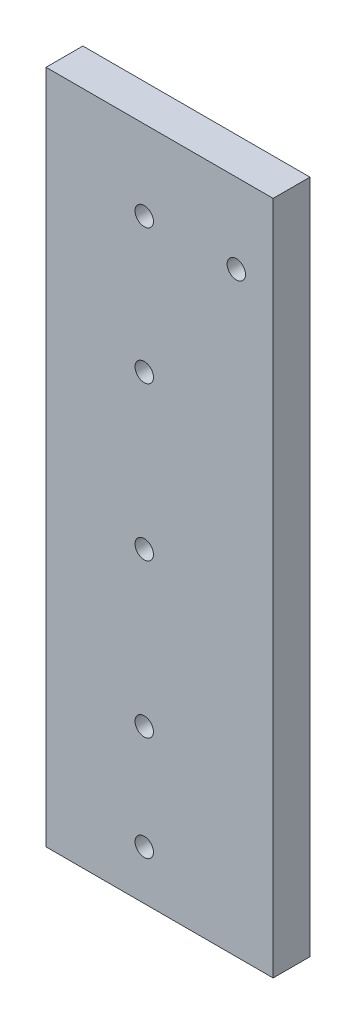
ISO-10303-21;
HEADER;
FILE_DESCRIPTION(('STEP AP214'),'2;1');
FILE_NAME('part.step','',(''),(''),'','','');
FILE_SCHEMA(('AUTOMOTIVE_DESIGN { 1 0 10303 214 1 1 1 1 }'));
ENDSEC;
DATA;
#1=APPLICATION_CONTEXT('core data for automotive mechanical design processes');
#2=APPLICATION_PROTOCOL_DEFINITION('international standard','automotive_design',2000,#1);
#3=PRODUCT_CONTEXT('',#1,'mechanical');
#4=PRODUCT('Part','Part','',(#3));
#5=PRODUCT_RELATED_PRODUCT_CATEGORY('part','',(#4));
#6=PRODUCT_DEFINITION_FORMATION('','',#4);
#7=PRODUCT_DEFINITION_CONTEXT('part definition',#1,'design');
#8=PRODUCT_DEFINITION('design','',#6,#7);
#9=PRODUCT_DEFINITION_SHAPE('','',#8);
#10=(LENGTH_UNIT() NAMED_UNIT(*) SI_UNIT(.MILLI.,.METRE.));
#11=(NAMED_UNIT(*) PLANE_ANGLE_UNIT() SI_UNIT($,.RADIAN.));
#12=(NAMED_UNIT(*) SI_UNIT($,.STERADIAN.) SOLID_ANGLE_UNIT());
#13=UNCERTAINTY_MEASURE_WITH_UNIT(LENGTH_MEASURE(1.E-05),#10,'distance_accuracy_value','');
#14=(GEOMETRIC_REPRESENTATION_CONTEXT(3) GLOBAL_UNCERTAINTY_ASSIGNED_CONTEXT((#13)) GLOBAL_UNIT_ASSIGNED_CONTEXT((#10,
#11,#12)) REPRESENTATION_CONTEXT('',''));
#15=CARTESIAN_POINT('',(0.,0.,0.));
#16=DIRECTION('',(0.,0.,1.));
#17=DIRECTION('',(1.,0.,0.));
#18=AXIS2_PLACEMENT_3D('',#15,#16,#17);
#19=CARTESIAN_POINT('',(0.,0.,30.));
#20=DIRECTION('',(0.,0.,-1.));
#21=DIRECTION('',(-1.,0.,0.));
#22=AXIS2_PLACEMENT_3D('',#19,#20,#21);
#23=PLANE('',#22);
#24=DIRECTION('',(0.,1.,0.));
#25=VECTOR('',#24,1.);
#26=CARTESIAN_POINT('',(92.5,-275.,30.));
#27=LINE('',#26,#25);
#28=CARTESIAN_POINT('',(92.5,-275.,30.));
#29=VERTEX_POINT('',#28);
#30=CARTESIAN_POINT('',(92.5,275.,30.));
#31=VERTEX_POINT('',#30);
#32=EDGE_CURVE('E96',#29,#31,#27,.T.);
#33=ORIENTED_EDGE('',*,*,#32,.T.);
#34=DIRECTION('',(-1.,0.,0.));
#35=VECTOR('',#34,1.);
#36=CARTESIAN_POINT('',(-92.5,275.,30.));
#37=LINE('',#36,#35);
#38=CARTESIAN_POINT('',(-92.5,275.,30.));
#39=VERTEX_POINT('',#38);
#40=EDGE_CURVE('E91',#31,#39,#37,.T.);
#41=ORIENTED_EDGE('',*,*,#40,.T.);
#42=DIRECTION('',(0.,-1.,0.));
#43=VECTOR('',#42,1.);
#44=CARTESIAN_POINT('',(-92.5,-275.,30.));
#45=LINE('',#44,#43);
#46=CARTESIAN_POINT('',(-92.5,-275.,30.));
#47=VERTEX_POINT('',#46);
#48=EDGE_CURVE('E94',#39,#47,#45,.T.);
#49=ORIENTED_EDGE('',*,*,#48,.T.);
#50=DIRECTION('',(1.,0.,0.));
#51=VECTOR('',#50,1.);
#52=CARTESIAN_POINT('',(-92.5,-275.,30.));
#53=LINE('',#52,#51);
#54=EDGE_CURVE('E61',#47,#29,#53,.T.);
#55=ORIENTED_EDGE('',*,*,#54,.T.);
#56=EDGE_LOOP('',(#33,#41,#49,#55));
#57=FACE_BOUND('',#56,.T.);
#58=CARTESIAN_POINT('',(62.5,210.,30.));
#59=DIRECTION('',(0.,0.,1.));
#60=DIRECTION('',(1.,0.,0.));
#61=AXIS2_PLACEMENT_3D('',#58,#59,#60);
#62=CIRCLE('',#61,7.50000000000001);
#63=CARTESIAN_POINT('',(70.,210.,30.));
#64=VERTEX_POINT('',#63);
#65=EDGE_CURVE('E116',#64,#64,#62,.T.);
#66=ORIENTED_EDGE('',*,*,#65,.F.);
#67=EDGE_LOOP('',(#66));
#68=FACE_BOUND('',#67,.T.);
#69=CARTESIAN_POINT('',(-12.5,210.,30.));
#70=DIRECTION('',(0.,0.,1.));
#71=DIRECTION('',(1.,0.,0.));
#72=AXIS2_PLACEMENT_3D('',#69,#70,#71);
#73=CIRCLE('',#72,7.5);
#74=CARTESIAN_POINT('',(-4.99999999999999,210.,30.));
#75=VERTEX_POINT('',#74);
#76=EDGE_CURVE('E138',#75,#75,#73,.T.);
#77=ORIENTED_EDGE('',*,*,#76,.F.);
#78=EDGE_LOOP('',(#77));
#79=FACE_BOUND('',#78,.T.);
#80=CARTESIAN_POINT('',(-12.5,-235.,30.));
#81=DIRECTION('',(0.,0.,1.));
#82=DIRECTION('',(1.,0.,0.));
#83=AXIS2_PLACEMENT_3D('',#80,#81,#82);
#84=CIRCLE('',#83,7.5);
#85=CARTESIAN_POINT('',(-4.99999999999999,-235.,30.));
#86=VERTEX_POINT('',#85);
#87=EDGE_CURVE('E146',#86,#86,#84,.T.);
#88=ORIENTED_EDGE('',*,*,#87,.F.);
#89=EDGE_LOOP('',(#88));
#90=FACE_BOUND('',#89,.T.);
#91=CARTESIAN_POINT('',(-12.5,-150.,30.));
#92=DIRECTION('',(0.,0.,1.));
#93=DIRECTION('',(1.,0.,0.));
#94=AXIS2_PLACEMENT_3D('',#91,#92,#93);
#95=CIRCLE('',#94,7.50000000000001);
#96=CARTESIAN_POINT('',(-4.99999999999999,-150.,30.));
#97=VERTEX_POINT('',#96);
#98=EDGE_CURVE('E154',#97,#97,#95,.T.);
#99=ORIENTED_EDGE('',*,*,#98,.F.);
#100=EDGE_LOOP('',(#99));
#101=FACE_BOUND('',#100,.T.);
#102=CARTESIAN_POINT('',(-12.5,-25.,30.));
#103=DIRECTION('',(0.,0.,1.));
#104=DIRECTION('',(1.,0.,0.));
#105=AXIS2_PLACEMENT_3D('',#102,#103,#104);
#106=CIRCLE('',#105,7.5);
#107=CARTESIAN_POINT('',(-5.,-25.,30.));
#108=VERTEX_POINT('',#107);
#109=EDGE_CURVE('E162',#108,#108,#106,.T.);
#110=ORIENTED_EDGE('',*,*,#109,.F.);
#111=EDGE_LOOP('',(#110));
#112=FACE_BOUND('',#111,.T.);
#113=CARTESIAN_POINT('',(-12.5,100.,30.));
#114=DIRECTION('',(0.,0.,1.));
#115=DIRECTION('',(1.,0.,0.));
#116=AXIS2_PLACEMENT_3D('',#113,#114,#115);
#117=CIRCLE('',#116,7.50000000000001);
#118=CARTESIAN_POINT('',(-4.99999999999999,100.,30.));
#119=VERTEX_POINT('',#118);
#120=EDGE_CURVE('E170',#119,#119,#117,.T.);
#121=ORIENTED_EDGE('',*,*,#120,.F.);
#122=EDGE_LOOP('',(#121));
#123=FACE_BOUND('',#122,.T.);
#124=ADVANCED_FACE('F43',(#57,#68,#79,#90,#101,#112,#123),#23,.F.);
#125=CARTESIAN_POINT('',(0.,0.,0.));
#126=DIRECTION('',(0.,0.,-1.));
#127=DIRECTION('',(-1.,0.,0.));
#128=AXIS2_PLACEMENT_3D('',#125,#126,#127);
#129=PLANE('',#128);
#130=CARTESIAN_POINT('',(-12.5,-25.,0.));
#131=DIRECTION('',(0.,0.,1.));
#132=DIRECTION('',(1.,0.,0.));
#133=AXIS2_PLACEMENT_3D('',#130,#131,#132);
#134=CIRCLE('',#133,7.5);
#135=CARTESIAN_POINT('',(-5.,-25.,0.));
#136=VERTEX_POINT('',#135);
#137=EDGE_CURVE('E166',#136,#136,#134,.T.);
#138=ORIENTED_EDGE('',*,*,#137,.T.);
#139=EDGE_LOOP('',(#138));
#140=FACE_BOUND('',#139,.T.);
#141=CARTESIAN_POINT('',(-12.5,-235.,0.));
#142=DIRECTION('',(0.,0.,1.));
#143=DIRECTION('',(1.,0.,0.));
#144=AXIS2_PLACEMENT_3D('',#141,#142,#143);
#145=CIRCLE('',#144,7.5);
#146=CARTESIAN_POINT('',(-4.99999999999999,-235.,0.));
#147=VERTEX_POINT('',#146);
#148=EDGE_CURVE('E150',#147,#147,#145,.T.);
#149=ORIENTED_EDGE('',*,*,#148,.T.);
#150=EDGE_LOOP('',(#149));
#151=FACE_BOUND('',#150,.T.);
#152=CARTESIAN_POINT('',(62.5,210.,0.));
#153=DIRECTION('',(0.,0.,1.));
#154=DIRECTION('',(1.,0.,0.));
#155=AXIS2_PLACEMENT_3D('',#152,#153,#154);
#156=CIRCLE('',#155,7.50000000000001);
#157=CARTESIAN_POINT('',(70.,210.,0.));
#158=VERTEX_POINT('',#157);
#159=EDGE_CURVE('E134',#158,#158,#156,.T.);
#160=ORIENTED_EDGE('',*,*,#159,.T.);
#161=EDGE_LOOP('',(#160));
#162=FACE_BOUND('',#161,.T.);
#163=DIRECTION('',(0.,1.,0.));
#164=VECTOR('',#163,1.);
#165=CARTESIAN_POINT('',(92.5,-275.,0.));
#166=LINE('',#165,#164);
#167=CARTESIAN_POINT('',(92.5,-275.,0.));
#168=VERTEX_POINT('',#167);
#169=CARTESIAN_POINT('',(92.5,275.,0.));
#170=VERTEX_POINT('',#169);
#171=EDGE_CURVE('E112',#168,#170,#166,.T.);
#172=ORIENTED_EDGE('',*,*,#171,.F.);
#173=DIRECTION('',(1.,0.,0.));
#174=VECTOR('',#173,1.);
#175=CARTESIAN_POINT('',(-92.5,-275.,0.));
#176=LINE('',#175,#174);
#177=CARTESIAN_POINT('',(-92.5,-275.,0.));
#178=VERTEX_POINT('',#177);
#179=EDGE_CURVE('E84',#178,#168,#176,.T.);
#180=ORIENTED_EDGE('',*,*,#179,.F.);
#181=DIRECTION('',(0.,-1.,0.));
#182=VECTOR('',#181,1.);
#183=CARTESIAN_POINT('',(-92.5,-275.,0.));
#184=LINE('',#183,#182);
#185=CARTESIAN_POINT('',(-92.5,275.,0.));
#186=VERTEX_POINT('',#185);
#187=EDGE_CURVE('E78',#186,#178,#184,.T.);
#188=ORIENTED_EDGE('',*,*,#187,.F.);
#189=DIRECTION('',(-1.,0.,0.));
#190=VECTOR('',#189,1.);
#191=CARTESIAN_POINT('',(-92.5,275.,0.));
#192=LINE('',#191,#190);
#193=EDGE_CURVE('E101',#170,#186,#192,.T.);
#194=ORIENTED_EDGE('',*,*,#193,.F.);
#195=EDGE_LOOP('',(#172,#180,#188,#194));
#196=FACE_BOUND('',#195,.T.);
#197=CARTESIAN_POINT('',(-12.5,210.,0.));
#198=DIRECTION('',(0.,0.,1.));
#199=DIRECTION('',(1.,0.,0.));
#200=AXIS2_PLACEMENT_3D('',#197,#198,#199);
#201=CIRCLE('',#200,7.5);
#202=CARTESIAN_POINT('',(-4.99999999999999,210.,0.));
#203=VERTEX_POINT('',#202);
#204=EDGE_CURVE('E142',#203,#203,#201,.T.);
#205=ORIENTED_EDGE('',*,*,#204,.T.);
#206=EDGE_LOOP('',(#205));
#207=FACE_BOUND('',#206,.T.);
#208=CARTESIAN_POINT('',(-12.5,-150.,0.));
#209=DIRECTION('',(0.,0.,1.));
#210=DIRECTION('',(1.,0.,0.));
#211=AXIS2_PLACEMENT_3D('',#208,#209,#210);
#212=CIRCLE('',#211,7.50000000000001);
#213=CARTESIAN_POINT('',(-4.99999999999999,-150.,0.));
#214=VERTEX_POINT('',#213);
#215=EDGE_CURVE('E158',#214,#214,#212,.T.);
#216=ORIENTED_EDGE('',*,*,#215,.T.);
#217=EDGE_LOOP('',(#216));
#218=FACE_BOUND('',#217,.T.);
#219=CARTESIAN_POINT('',(-12.5,100.,0.));
#220=DIRECTION('',(0.,0.,1.));
#221=DIRECTION('',(1.,0.,0.));
#222=AXIS2_PLACEMENT_3D('',#219,#220,#221);
#223=CIRCLE('',#222,7.50000000000001);
#224=CARTESIAN_POINT('',(-4.99999999999999,100.,0.));
#225=VERTEX_POINT('',#224);
#226=EDGE_CURVE('E174',#225,#225,#223,.T.);
#227=ORIENTED_EDGE('',*,*,#226,.T.);
#228=EDGE_LOOP('',(#227));
#229=FACE_BOUND('',#228,.T.);
#230=ADVANCED_FACE('F129',(#140,#151,#162,#196,#207,#218,#229),#129,.T.);
#231=CARTESIAN_POINT('',(92.5,-275.,30.));
#232=DIRECTION('',(-1.,0.,0.));
#233=DIRECTION('',(0.,0.,1.));
#234=AXIS2_PLACEMENT_3D('',#231,#232,#233);
#235=PLANE('',#234);
#236=ORIENTED_EDGE('',*,*,#171,.T.);
#237=DIRECTION('',(0.,0.,-1.));
#238=VECTOR('',#237,1.);
#239=CARTESIAN_POINT('',(92.5,275.,30.));
#240=LINE('',#239,#238);
#241=EDGE_CURVE('E11',#31,#170,#240,.T.);
#242=ORIENTED_EDGE('',*,*,#241,.F.);
#243=ORIENTED_EDGE('',*,*,#32,.F.);
#244=DIRECTION('',(0.,0.,-1.));
#245=VECTOR('',#244,1.);
#246=CARTESIAN_POINT('',(92.5,-275.,30.));
#247=LINE('',#246,#245);
#248=EDGE_CURVE('E108',#29,#168,#247,.T.);
#249=ORIENTED_EDGE('',*,*,#248,.T.);
#250=EDGE_LOOP('',(#236,#242,#243,#249));
#251=FACE_BOUND('',#250,.T.);
#252=ADVANCED_FACE('F45',(#251),#235,.F.);
#253=CARTESIAN_POINT('',(-92.5,275.,30.));
#254=DIRECTION('',(0.,-1.,0.));
#255=DIRECTION('',(0.,0.,-1.));
#256=AXIS2_PLACEMENT_3D('',#253,#254,#255);
#257=PLANE('',#256);
#258=ORIENTED_EDGE('',*,*,#193,.T.);
#259=DIRECTION('',(0.,0.,-1.));
#260=VECTOR('',#259,1.);
#261=CARTESIAN_POINT('',(-92.5,275.,30.));
#262=LINE('',#261,#260);
#263=EDGE_CURVE('E53',#39,#186,#262,.T.);
#264=ORIENTED_EDGE('',*,*,#263,.F.);
#265=ORIENTED_EDGE('',*,*,#40,.F.);
#266=ORIENTED_EDGE('',*,*,#241,.T.);
#267=EDGE_LOOP('',(#258,#264,#265,#266));
#268=FACE_BOUND('',#267,.T.);
#269=ADVANCED_FACE('F100',(#268),#257,.F.);
#270=CARTESIAN_POINT('',(-92.5,-275.,30.));
#271=DIRECTION('',(1.,0.,0.));
#272=DIRECTION('',(0.,0.,-1.));
#273=AXIS2_PLACEMENT_3D('',#270,#271,#272);
#274=PLANE('',#273);
#275=ORIENTED_EDGE('',*,*,#187,.T.);
#276=DIRECTION('',(0.,0.,-1.));
#277=VECTOR('',#276,1.);
#278=CARTESIAN_POINT('',(-92.5,-275.,30.));
#279=LINE('',#278,#277);
#280=EDGE_CURVE('E103',#47,#178,#279,.T.);
#281=ORIENTED_EDGE('',*,*,#280,.F.);
#282=ORIENTED_EDGE('',*,*,#48,.F.);
#283=ORIENTED_EDGE('',*,*,#263,.T.);
#284=EDGE_LOOP('',(#275,#281,#282,#283));
#285=FACE_BOUND('',#284,.T.);
#286=ADVANCED_FACE('F104',(#285),#274,.F.);
#287=CARTESIAN_POINT('',(-92.5,-275.,30.));
#288=DIRECTION('',(0.,1.,0.));
#289=DIRECTION('',(0.,0.,1.));
#290=AXIS2_PLACEMENT_3D('',#287,#288,#289);
#291=PLANE('',#290);
#292=ORIENTED_EDGE('',*,*,#179,.T.);
#293=ORIENTED_EDGE('',*,*,#248,.F.);
#294=ORIENTED_EDGE('',*,*,#54,.F.);
#295=ORIENTED_EDGE('',*,*,#280,.T.);
#296=EDGE_LOOP('',(#292,#293,#294,#295));
#297=FACE_BOUND('',#296,.T.);
#298=ADVANCED_FACE('F126',(#297),#291,.F.);
#299=CARTESIAN_POINT('',(62.5,210.,30.));
#300=DIRECTION('',(0.,0.,-1.));
#301=DIRECTION('',(-1.,0.,0.));
#302=AXIS2_PLACEMENT_3D('',#299,#300,#301);
#303=CYLINDRICAL_SURFACE('',#302,7.50000000000001);
#304=ORIENTED_EDGE('',*,*,#65,.T.);
#305=EDGE_LOOP('',(#304));
#306=FACE_BOUND('',#305,.T.);
#307=ORIENTED_EDGE('',*,*,#159,.F.);
#308=EDGE_LOOP('',(#307));
#309=FACE_BOUND('',#308,.T.);
#310=ADVANCED_FACE('F193',(#306,#309),#303,.F.);
#311=CARTESIAN_POINT('',(-12.5,210.,30.));
#312=DIRECTION('',(0.,0.,-1.));
#313=DIRECTION('',(-1.,0.,0.));
#314=AXIS2_PLACEMENT_3D('',#311,#312,#313);
#315=CYLINDRICAL_SURFACE('',#314,7.5);
#316=ORIENTED_EDGE('',*,*,#76,.T.);
#317=EDGE_LOOP('',(#316));
#318=FACE_BOUND('',#317,.T.);
#319=ORIENTED_EDGE('',*,*,#204,.F.);
#320=EDGE_LOOP('',(#319));
#321=FACE_BOUND('',#320,.T.);
#322=ADVANCED_FACE('F247',(#318,#321),#315,.F.);
#323=CARTESIAN_POINT('',(-12.5,-235.,30.));
#324=DIRECTION('',(0.,0.,-1.));
#325=DIRECTION('',(-1.,0.,0.));
#326=AXIS2_PLACEMENT_3D('',#323,#324,#325);
#327=CYLINDRICAL_SURFACE('',#326,7.5);
#328=ORIENTED_EDGE('',*,*,#87,.T.);
#329=EDGE_LOOP('',(#328));
#330=FACE_BOUND('',#329,.T.);
#331=ORIENTED_EDGE('',*,*,#148,.F.);
#332=EDGE_LOOP('',(#331));
#333=FACE_BOUND('',#332,.T.);
#334=ADVANCED_FACE('F256',(#330,#333),#327,.F.);
#335=CARTESIAN_POINT('',(-12.5,-150.,30.));
#336=DIRECTION('',(0.,0.,-1.));
#337=DIRECTION('',(-1.,0.,0.));
#338=AXIS2_PLACEMENT_3D('',#335,#336,#337);
#339=CYLINDRICAL_SURFACE('',#338,7.50000000000001);
#340=ORIENTED_EDGE('',*,*,#98,.T.);
#341=EDGE_LOOP('',(#340));
#342=FACE_BOUND('',#341,.T.);
#343=ORIENTED_EDGE('',*,*,#215,.F.);
#344=EDGE_LOOP('',(#343));
#345=FACE_BOUND('',#344,.T.);
#346=ADVANCED_FACE('F265',(#342,#345),#339,.F.);
#347=CARTESIAN_POINT('',(-12.5,-25.,30.));
#348=DIRECTION('',(0.,0.,-1.));
#349=DIRECTION('',(-1.,0.,0.));
#350=AXIS2_PLACEMENT_3D('',#347,#348,#349);
#351=CYLINDRICAL_SURFACE('',#350,7.5);
#352=ORIENTED_EDGE('',*,*,#109,.T.);
#353=EDGE_LOOP('',(#352));
#354=FACE_BOUND('',#353,.T.);
#355=ORIENTED_EDGE('',*,*,#137,.F.);
#356=EDGE_LOOP('',(#355));
#357=FACE_BOUND('',#356,.T.);
#358=ADVANCED_FACE('F275',(#354,#357),#351,.F.);
#359=CARTESIAN_POINT('',(-12.5,100.,30.));
#360=DIRECTION('',(0.,0.,-1.));
#361=DIRECTION('',(-1.,0.,0.));
#362=AXIS2_PLACEMENT_3D('',#359,#360,#361);
#363=CYLINDRICAL_SURFACE('',#362,7.50000000000001);
#364=ORIENTED_EDGE('',*,*,#120,.T.);
#365=EDGE_LOOP('',(#364));
#366=FACE_BOUND('',#365,.T.);
#367=ORIENTED_EDGE('',*,*,#226,.F.);
#368=EDGE_LOOP('',(#367));
#369=FACE_BOUND('',#368,.T.);
#370=ADVANCED_FACE('F182',(#366,#369),#363,.F.);
#371=CLOSED_SHELL('',(#124,#230,#252,#269,#286,#298,#310,#322,#334,#346,#358,#370));
#372=MANIFOLD_SOLID_BREP('B2',#371);
#373=ADVANCED_BREP_SHAPE_REPRESENTATION('',(#18,#372),#14);
#374=SHAPE_DEFINITION_REPRESENTATION(#9,#373);
ENDSEC;
END-ISO-10303-21;
